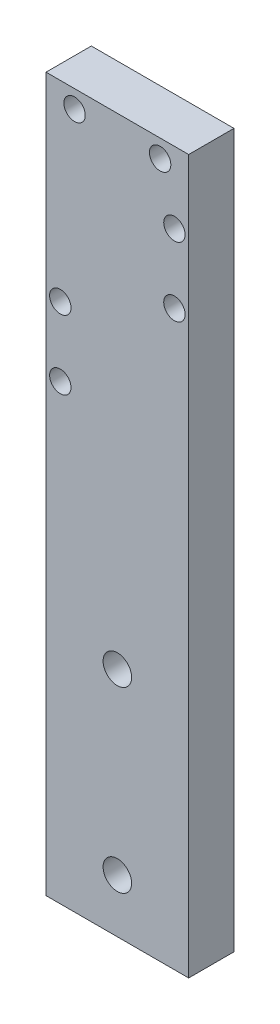
ISO-10303-21;
HEADER;
FILE_DESCRIPTION(('STEP AP214'),'2;1');
FILE_NAME('part.step','',(''),(''),'','','');
FILE_SCHEMA(('AUTOMOTIVE_DESIGN { 1 0 10303 214 1 1 1 1 }'));
ENDSEC;
DATA;
#1=APPLICATION_CONTEXT('core data for automotive mechanical design processes');
#2=APPLICATION_PROTOCOL_DEFINITION('international standard','automotive_design',2000,#1);
#3=PRODUCT_CONTEXT('',#1,'mechanical');
#4=PRODUCT('Part','Part','',(#3));
#5=PRODUCT_RELATED_PRODUCT_CATEGORY('part','',(#4));
#6=PRODUCT_DEFINITION_FORMATION('','',#4);
#7=PRODUCT_DEFINITION_CONTEXT('part definition',#1,'design');
#8=PRODUCT_DEFINITION('design','',#6,#7);
#9=PRODUCT_DEFINITION_SHAPE('','',#8);
#10=(LENGTH_UNIT() NAMED_UNIT(*) SI_UNIT(.MILLI.,.METRE.));
#11=(NAMED_UNIT(*) PLANE_ANGLE_UNIT() SI_UNIT($,.RADIAN.));
#12=(NAMED_UNIT(*) SI_UNIT($,.STERADIAN.) SOLID_ANGLE_UNIT());
#13=UNCERTAINTY_MEASURE_WITH_UNIT(LENGTH_MEASURE(1.E-05),#10,'distance_accuracy_value','');
#14=(GEOMETRIC_REPRESENTATION_CONTEXT(3) GLOBAL_UNCERTAINTY_ASSIGNED_CONTEXT((#13)) GLOBAL_UNIT_ASSIGNED_CONTEXT((#10,
#11,#12)) REPRESENTATION_CONTEXT('',''));
#15=CARTESIAN_POINT('',(0.,0.,0.));
#16=DIRECTION('',(0.,0.,1.));
#17=DIRECTION('',(1.,0.,0.));
#18=AXIS2_PLACEMENT_3D('',#15,#16,#17);
#19=CARTESIAN_POINT('',(0.,0.,6.35));
#20=DIRECTION('',(0.,0.,-1.));
#21=DIRECTION('',(-1.,0.,0.));
#22=AXIS2_PLACEMENT_3D('',#19,#20,#21);
#23=PLANE('',#22);
#24=CARTESIAN_POINT('',(4.00000000000001,97.5,6.35));
#25=DIRECTION('',(0.,0.,-1.));
#26=DIRECTION('',(-1.,0.,0.));
#27=AXIS2_PLACEMENT_3D('',#24,#25,#26);
#28=CIRCLE('',#27,1.5);
#29=CARTESIAN_POINT('',(2.50000000000001,97.5,6.35));
#30=VERTEX_POINT('',#29);
#31=EDGE_CURVE('E97',#30,#30,#28,.T.);
#32=ORIENTED_EDGE('',*,*,#31,.T.);
#33=EDGE_LOOP('',(#32));
#34=FACE_BOUND('',#33,.T.);
#35=CARTESIAN_POINT('',(18.,90.,6.35));
#36=DIRECTION('',(0.,0.,-1.));
#37=DIRECTION('',(-1.,0.,0.));
#38=AXIS2_PLACEMENT_3D('',#35,#36,#37);
#39=CIRCLE('',#38,1.5);
#40=CARTESIAN_POINT('',(16.5,90.,6.35));
#41=VERTEX_POINT('',#40);
#42=EDGE_CURVE('E100',#41,#41,#39,.T.);
#43=ORIENTED_EDGE('',*,*,#42,.T.);
#44=EDGE_LOOP('',(#43));
#45=FACE_BOUND('',#44,.T.);
#46=CARTESIAN_POINT('',(2.,63.4481639052965,6.35));
#47=DIRECTION('',(0.,0.,-1.));
#48=DIRECTION('',(-1.,0.,0.));
#49=AXIS2_PLACEMENT_3D('',#46,#47,#48);
#50=CIRCLE('',#49,1.5);
#51=CARTESIAN_POINT('',(0.499999999999999,63.4481639052965,6.35));
#52=VERTEX_POINT('',#51);
#53=EDGE_CURVE('E285',#52,#52,#50,.T.);
#54=ORIENTED_EDGE('',*,*,#53,.T.);
#55=EDGE_LOOP('',(#54));
#56=FACE_BOUND('',#55,.T.);
#57=CARTESIAN_POINT('',(2.,73.1310195921627,6.35));
#58=DIRECTION('',(0.,0.,-1.));
#59=DIRECTION('',(-1.,0.,0.));
#60=AXIS2_PLACEMENT_3D('',#57,#58,#59);
#61=CIRCLE('',#60,1.5);
#62=CARTESIAN_POINT('',(0.5,73.1310195921627,6.35));
#63=VERTEX_POINT('',#62);
#64=EDGE_CURVE('E289',#63,#63,#61,.T.);
#65=ORIENTED_EDGE('',*,*,#64,.T.);
#66=EDGE_LOOP('',(#65));
#67=FACE_BOUND('',#66,.T.);
#68=CARTESIAN_POINT('',(18.,80.3171443131339,6.35));
#69=DIRECTION('',(0.,0.,-1.));
#70=DIRECTION('',(-1.,0.,0.));
#71=AXIS2_PLACEMENT_3D('',#68,#69,#70);
#72=CIRCLE('',#71,1.5);
#73=CARTESIAN_POINT('',(16.5,80.3171443131339,6.35));
#74=VERTEX_POINT('',#73);
#75=EDGE_CURVE('E293',#74,#74,#72,.T.);
#76=ORIENTED_EDGE('',*,*,#75,.T.);
#77=EDGE_LOOP('',(#76));
#78=FACE_BOUND('',#77,.T.);
#79=CARTESIAN_POINT('',(16.,97.5,6.35));
#80=DIRECTION('',(0.,0.,-1.));
#81=DIRECTION('',(-1.,0.,0.));
#82=AXIS2_PLACEMENT_3D('',#79,#80,#81);
#83=CIRCLE('',#82,1.5);
#84=CARTESIAN_POINT('',(14.5,97.5,6.35));
#85=VERTEX_POINT('',#84);
#86=EDGE_CURVE('E296',#85,#85,#83,.T.);
#87=ORIENTED_EDGE('',*,*,#86,.T.);
#88=EDGE_LOOP('',(#87));
#89=FACE_BOUND('',#88,.T.);
#90=DIRECTION('',(0.,-1.,0.));
#91=VECTOR('',#90,1.);
#92=CARTESIAN_POINT('',(0.,0.,6.35));
#93=LINE('',#92,#91);
#94=CARTESIAN_POINT('',(0.,100.,6.35));
#95=VERTEX_POINT('',#94);
#96=CARTESIAN_POINT('',(0.,0.,6.35));
#97=VERTEX_POINT('',#96);
#98=EDGE_CURVE('E82',#95,#97,#93,.T.);
#99=ORIENTED_EDGE('',*,*,#98,.T.);
#100=DIRECTION('',(1.,0.,0.));
#101=VECTOR('',#100,1.);
#102=CARTESIAN_POINT('',(0.,0.,6.35));
#103=LINE('',#102,#101);
#104=CARTESIAN_POINT('',(20.,0.,6.35));
#105=VERTEX_POINT('',#104);
#106=EDGE_CURVE('E50',#97,#105,#103,.T.);
#107=ORIENTED_EDGE('',*,*,#106,.T.);
#108=DIRECTION('',(0.,1.,0.));
#109=VECTOR('',#108,1.);
#110=CARTESIAN_POINT('',(20.,0.,6.35));
#111=LINE('',#110,#109);
#112=CARTESIAN_POINT('',(20.,100.,6.35));
#113=VERTEX_POINT('',#112);
#114=EDGE_CURVE('E65',#105,#113,#111,.T.);
#115=ORIENTED_EDGE('',*,*,#114,.T.);
#116=DIRECTION('',(1.,0.,0.));
#117=VECTOR('',#116,1.);
#118=CARTESIAN_POINT('',(20.,100.,6.35));
#119=LINE('',#118,#117);
#120=EDGE_CURVE('E96',#95,#113,#119,.T.);
#121=ORIENTED_EDGE('',*,*,#120,.F.);
#122=EDGE_LOOP('',(#99,#107,#115,#121));
#123=FACE_BOUND('',#122,.T.);
#124=CARTESIAN_POINT('',(10.,32.5,6.35));
#125=DIRECTION('',(0.,0.,1.));
#126=DIRECTION('',(1.,0.,0.));
#127=AXIS2_PLACEMENT_3D('',#124,#125,#126);
#128=CIRCLE('',#127,2.);
#129=CARTESIAN_POINT('',(12.,32.5,6.35));
#130=VERTEX_POINT('',#129);
#131=EDGE_CURVE('E113',#130,#130,#128,.T.);
#132=ORIENTED_EDGE('',*,*,#131,.F.);
#133=EDGE_LOOP('',(#132));
#134=FACE_BOUND('',#133,.T.);
#135=CARTESIAN_POINT('',(10.,7.5,6.35));
#136=DIRECTION('',(0.,0.,1.));
#137=DIRECTION('',(1.,0.,0.));
#138=AXIS2_PLACEMENT_3D('',#135,#136,#137);
#139=CIRCLE('',#138,2.);
#140=CARTESIAN_POINT('',(12.,7.5,6.35));
#141=VERTEX_POINT('',#140);
#142=EDGE_CURVE('E107',#141,#141,#139,.T.);
#143=ORIENTED_EDGE('',*,*,#142,.F.);
#144=EDGE_LOOP('',(#143));
#145=FACE_BOUND('',#144,.T.);
#146=ADVANCED_FACE('F33',(#34,#45,#56,#67,#78,#89,#123,#134,#145),#23,.F.);
#147=CARTESIAN_POINT('',(0.,0.,0.));
#148=DIRECTION('',(0.,0.,-1.));
#149=DIRECTION('',(-1.,0.,0.));
#150=AXIS2_PLACEMENT_3D('',#147,#148,#149);
#151=PLANE('',#150);
#152=CARTESIAN_POINT('',(4.00000000000001,97.5,0.));
#153=DIRECTION('',(0.,0.,-1.));
#154=DIRECTION('',(-1.,0.,0.));
#155=AXIS2_PLACEMENT_3D('',#152,#153,#154);
#156=CIRCLE('',#155,1.5);
#157=CARTESIAN_POINT('',(2.50000000000001,97.5,0.));
#158=VERTEX_POINT('',#157);
#159=EDGE_CURVE('E276',#158,#158,#156,.T.);
#160=ORIENTED_EDGE('',*,*,#159,.F.);
#161=EDGE_LOOP('',(#160));
#162=FACE_BOUND('',#161,.T.);
#163=CARTESIAN_POINT('',(18.,90.,0.));
#164=DIRECTION('',(0.,0.,-1.));
#165=DIRECTION('',(-1.,0.,0.));
#166=AXIS2_PLACEMENT_3D('',#163,#164,#165);
#167=CIRCLE('',#166,1.5);
#168=CARTESIAN_POINT('',(16.5,90.,0.));
#169=VERTEX_POINT('',#168);
#170=EDGE_CURVE('E313',#169,#169,#167,.T.);
#171=ORIENTED_EDGE('',*,*,#170,.F.);
#172=EDGE_LOOP('',(#171));
#173=FACE_BOUND('',#172,.T.);
#174=CARTESIAN_POINT('',(2.,63.4481639052965,0.));
#175=DIRECTION('',(0.,0.,-1.));
#176=DIRECTION('',(-1.,0.,0.));
#177=AXIS2_PLACEMENT_3D('',#174,#175,#176);
#178=CIRCLE('',#177,1.5);
#179=CARTESIAN_POINT('',(0.499999999999999,63.4481639052965,0.));
#180=VERTEX_POINT('',#179);
#181=EDGE_CURVE('E309',#180,#180,#178,.T.);
#182=ORIENTED_EDGE('',*,*,#181,.F.);
#183=EDGE_LOOP('',(#182));
#184=FACE_BOUND('',#183,.T.);
#185=CARTESIAN_POINT('',(2.,73.1310195921627,0.));
#186=DIRECTION('',(0.,0.,-1.));
#187=DIRECTION('',(-1.,0.,0.));
#188=AXIS2_PLACEMENT_3D('',#185,#186,#187);
#189=CIRCLE('',#188,1.5);
#190=CARTESIAN_POINT('',(0.5,73.1310195921627,0.));
#191=VERTEX_POINT('',#190);
#192=EDGE_CURVE('E306',#191,#191,#189,.T.);
#193=ORIENTED_EDGE('',*,*,#192,.F.);
#194=EDGE_LOOP('',(#193));
#195=FACE_BOUND('',#194,.T.);
#196=CARTESIAN_POINT('',(18.,80.3171443131339,0.));
#197=DIRECTION('',(0.,0.,-1.));
#198=DIRECTION('',(-1.,0.,0.));
#199=AXIS2_PLACEMENT_3D('',#196,#197,#198);
#200=CIRCLE('',#199,1.5);
#201=CARTESIAN_POINT('',(16.5,80.3171443131339,0.));
#202=VERTEX_POINT('',#201);
#203=EDGE_CURVE('E310',#202,#202,#200,.T.);
#204=ORIENTED_EDGE('',*,*,#203,.F.);
#205=EDGE_LOOP('',(#204));
#206=FACE_BOUND('',#205,.T.);
#207=CARTESIAN_POINT('',(16.,97.5,0.));
#208=DIRECTION('',(0.,0.,-1.));
#209=DIRECTION('',(-1.,0.,0.));
#210=AXIS2_PLACEMENT_3D('',#207,#208,#209);
#211=CIRCLE('',#210,1.5);
#212=CARTESIAN_POINT('',(14.5,97.5,0.));
#213=VERTEX_POINT('',#212);
#214=EDGE_CURVE('E298',#213,#213,#211,.T.);
#215=ORIENTED_EDGE('',*,*,#214,.F.);
#216=EDGE_LOOP('',(#215));
#217=FACE_BOUND('',#216,.T.);
#218=CARTESIAN_POINT('',(10.,32.5,0.));
#219=DIRECTION('',(0.,0.,1.));
#220=DIRECTION('',(1.,0.,0.));
#221=AXIS2_PLACEMENT_3D('',#218,#219,#220);
#222=CIRCLE('',#221,2.);
#223=CARTESIAN_POINT('',(12.,32.5,0.));
#224=VERTEX_POINT('',#223);
#225=EDGE_CURVE('E110',#224,#224,#222,.T.);
#226=ORIENTED_EDGE('',*,*,#225,.T.);
#227=EDGE_LOOP('',(#226));
#228=FACE_BOUND('',#227,.T.);
#229=DIRECTION('',(0.,-1.,0.));
#230=VECTOR('',#229,1.);
#231=CARTESIAN_POINT('',(0.,0.,0.));
#232=LINE('',#231,#230);
#233=CARTESIAN_POINT('',(0.,100.,0.));
#234=VERTEX_POINT('',#233);
#235=CARTESIAN_POINT('',(0.,0.,0.));
#236=VERTEX_POINT('',#235);
#237=EDGE_CURVE('E89',#234,#236,#232,.T.);
#238=ORIENTED_EDGE('',*,*,#237,.F.);
#239=DIRECTION('',(-1.,0.,0.));
#240=VECTOR('',#239,1.);
#241=CARTESIAN_POINT('',(20.,100.,0.));
#242=LINE('',#241,#240);
#243=CARTESIAN_POINT('',(20.,100.,0.));
#244=VERTEX_POINT('',#243);
#245=EDGE_CURVE('E85',#244,#234,#242,.T.);
#246=ORIENTED_EDGE('',*,*,#245,.F.);
#247=DIRECTION('',(0.,1.,0.));
#248=VECTOR('',#247,1.);
#249=CARTESIAN_POINT('',(20.,0.,0.));
#250=LINE('',#249,#248);
#251=CARTESIAN_POINT('',(20.,0.,0.));
#252=VERTEX_POINT('',#251);
#253=EDGE_CURVE('E77',#252,#244,#250,.T.);
#254=ORIENTED_EDGE('',*,*,#253,.F.);
#255=DIRECTION('',(1.,0.,0.));
#256=VECTOR('',#255,1.);
#257=CARTESIAN_POINT('',(0.,0.,0.));
#258=LINE('',#257,#256);
#259=EDGE_CURVE('E61',#236,#252,#258,.T.);
#260=ORIENTED_EDGE('',*,*,#259,.F.);
#261=EDGE_LOOP('',(#238,#246,#254,#260));
#262=FACE_BOUND('',#261,.T.);
#263=CARTESIAN_POINT('',(10.,7.5,0.));
#264=DIRECTION('',(0.,0.,1.));
#265=DIRECTION('',(1.,0.,0.));
#266=AXIS2_PLACEMENT_3D('',#263,#264,#265);
#267=CIRCLE('',#266,2.);
#268=CARTESIAN_POINT('',(12.,7.5,0.));
#269=VERTEX_POINT('',#268);
#270=EDGE_CURVE('E106',#269,#269,#267,.T.);
#271=ORIENTED_EDGE('',*,*,#270,.T.);
#272=EDGE_LOOP('',(#271));
#273=FACE_BOUND('',#272,.T.);
#274=ADVANCED_FACE('F86',(#162,#173,#184,#195,#206,#217,#228,#262,#273),#151,.T.);
#275=CARTESIAN_POINT('',(0.,0.,6.35));
#276=DIRECTION('',(1.,0.,0.));
#277=DIRECTION('',(0.,0.,-1.));
#278=AXIS2_PLACEMENT_3D('',#275,#276,#277);
#279=PLANE('',#278);
#280=ORIENTED_EDGE('',*,*,#237,.T.);
#281=DIRECTION('',(0.,0.,-1.));
#282=VECTOR('',#281,1.);
#283=CARTESIAN_POINT('',(0.,0.,6.35));
#284=LINE('',#283,#282);
#285=EDGE_CURVE('E11',#97,#236,#284,.T.);
#286=ORIENTED_EDGE('',*,*,#285,.F.);
#287=ORIENTED_EDGE('',*,*,#98,.F.);
#288=DIRECTION('',(0.,0.,1.));
#289=VECTOR('',#288,1.);
#290=CARTESIAN_POINT('',(0.,100.,6.35));
#291=LINE('',#290,#289);
#292=EDGE_CURVE('E93',#234,#95,#291,.T.);
#293=ORIENTED_EDGE('',*,*,#292,.F.);
#294=EDGE_LOOP('',(#280,#286,#287,#293));
#295=FACE_BOUND('',#294,.T.);
#296=ADVANCED_FACE('F35',(#295),#279,.F.);
#297=CARTESIAN_POINT('',(0.,0.,6.35));
#298=DIRECTION('',(0.,1.,0.));
#299=DIRECTION('',(0.,0.,1.));
#300=AXIS2_PLACEMENT_3D('',#297,#298,#299);
#301=PLANE('',#300);
#302=ORIENTED_EDGE('',*,*,#259,.T.);
#303=DIRECTION('',(0.,0.,-1.));
#304=VECTOR('',#303,1.);
#305=CARTESIAN_POINT('',(20.,0.,6.35));
#306=LINE('',#305,#304);
#307=EDGE_CURVE('E42',#105,#252,#306,.T.);
#308=ORIENTED_EDGE('',*,*,#307,.F.);
#309=ORIENTED_EDGE('',*,*,#106,.F.);
#310=ORIENTED_EDGE('',*,*,#285,.T.);
#311=EDGE_LOOP('',(#302,#308,#309,#310));
#312=FACE_BOUND('',#311,.T.);
#313=ADVANCED_FACE('F123',(#312),#301,.F.);
#314=CARTESIAN_POINT('',(20.,0.,6.35));
#315=DIRECTION('',(-1.,0.,0.));
#316=DIRECTION('',(0.,0.,1.));
#317=AXIS2_PLACEMENT_3D('',#314,#315,#316);
#318=PLANE('',#317);
#319=ORIENTED_EDGE('',*,*,#253,.T.);
#320=DIRECTION('',(0.,0.,-1.));
#321=VECTOR('',#320,1.);
#322=CARTESIAN_POINT('',(20.,100.,6.35));
#323=LINE('',#322,#321);
#324=EDGE_CURVE('E81',#113,#244,#323,.T.);
#325=ORIENTED_EDGE('',*,*,#324,.F.);
#326=ORIENTED_EDGE('',*,*,#114,.F.);
#327=ORIENTED_EDGE('',*,*,#307,.T.);
#328=EDGE_LOOP('',(#319,#325,#326,#327));
#329=FACE_BOUND('',#328,.T.);
#330=ADVANCED_FACE('F79',(#329),#318,.F.);
#331=CARTESIAN_POINT('',(10.,32.5,6.35));
#332=DIRECTION('',(0.,0.,-1.));
#333=DIRECTION('',(-1.,0.,0.));
#334=AXIS2_PLACEMENT_3D('',#331,#332,#333);
#335=CYLINDRICAL_SURFACE('',#334,2.);
#336=ORIENTED_EDGE('',*,*,#131,.T.);
#337=EDGE_LOOP('',(#336));
#338=FACE_BOUND('',#337,.T.);
#339=ORIENTED_EDGE('',*,*,#225,.F.);
#340=EDGE_LOOP('',(#339));
#341=FACE_BOUND('',#340,.T.);
#342=ADVANCED_FACE('F137',(#338,#341),#335,.F.);
#343=CARTESIAN_POINT('',(10.,7.5,6.35));
#344=DIRECTION('',(0.,0.,-1.));
#345=DIRECTION('',(-1.,0.,0.));
#346=AXIS2_PLACEMENT_3D('',#343,#344,#345);
#347=CYLINDRICAL_SURFACE('',#346,2.);
#348=ORIENTED_EDGE('',*,*,#142,.T.);
#349=EDGE_LOOP('',(#348));
#350=FACE_BOUND('',#349,.T.);
#351=ORIENTED_EDGE('',*,*,#270,.F.);
#352=EDGE_LOOP('',(#351));
#353=FACE_BOUND('',#352,.T.);
#354=ADVANCED_FACE('F134',(#350,#353),#347,.F.);
#355=CARTESIAN_POINT('',(0.,100.,0.));
#356=DIRECTION('',(0.,1.,0.));
#357=DIRECTION('',(0.,0.,1.));
#358=AXIS2_PLACEMENT_3D('',#355,#356,#357);
#359=PLANE('',#358);
#360=ORIENTED_EDGE('',*,*,#324,.T.);
#361=ORIENTED_EDGE('',*,*,#245,.T.);
#362=ORIENTED_EDGE('',*,*,#292,.T.);
#363=ORIENTED_EDGE('',*,*,#120,.T.);
#364=EDGE_LOOP('',(#360,#361,#362,#363));
#365=FACE_BOUND('',#364,.T.);
#366=ADVANCED_FACE('F95',(#365),#359,.T.);
#367=CARTESIAN_POINT('',(16.,97.5,23.2));
#368=DIRECTION('',(0.,0.,-1.));
#369=DIRECTION('',(-1.,0.,0.));
#370=AXIS2_PLACEMENT_3D('',#367,#368,#369);
#371=CYLINDRICAL_SURFACE('',#370,1.5);
#372=ORIENTED_EDGE('',*,*,#214,.T.);
#373=EDGE_LOOP('',(#372));
#374=FACE_BOUND('',#373,.T.);
#375=ORIENTED_EDGE('',*,*,#86,.F.);
#376=EDGE_LOOP('',(#375));
#377=FACE_BOUND('',#376,.T.);
#378=ADVANCED_FACE('F176',(#374,#377),#371,.F.);
#379=CARTESIAN_POINT('',(18.,80.3171443131339,23.2));
#380=DIRECTION('',(0.,0.,-1.));
#381=DIRECTION('',(-1.,0.,0.));
#382=AXIS2_PLACEMENT_3D('',#379,#380,#381);
#383=CYLINDRICAL_SURFACE('',#382,1.5);
#384=ORIENTED_EDGE('',*,*,#203,.T.);
#385=EDGE_LOOP('',(#384));
#386=FACE_BOUND('',#385,.T.);
#387=ORIENTED_EDGE('',*,*,#75,.F.);
#388=EDGE_LOOP('',(#387));
#389=FACE_BOUND('',#388,.T.);
#390=ADVANCED_FACE('F184',(#386,#389),#383,.F.);
#391=CARTESIAN_POINT('',(2.,73.1310195921627,23.2));
#392=DIRECTION('',(0.,0.,-1.));
#393=DIRECTION('',(-1.,0.,0.));
#394=AXIS2_PLACEMENT_3D('',#391,#392,#393);
#395=CYLINDRICAL_SURFACE('',#394,1.5);
#396=ORIENTED_EDGE('',*,*,#192,.T.);
#397=EDGE_LOOP('',(#396));
#398=FACE_BOUND('',#397,.T.);
#399=ORIENTED_EDGE('',*,*,#64,.F.);
#400=EDGE_LOOP('',(#399));
#401=FACE_BOUND('',#400,.T.);
#402=ADVANCED_FACE('F192',(#398,#401),#395,.F.);
#403=CARTESIAN_POINT('',(2.,63.4481639052965,23.2));
#404=DIRECTION('',(0.,0.,-1.));
#405=DIRECTION('',(-1.,0.,0.));
#406=AXIS2_PLACEMENT_3D('',#403,#404,#405);
#407=CYLINDRICAL_SURFACE('',#406,1.5);
#408=ORIENTED_EDGE('',*,*,#181,.T.);
#409=EDGE_LOOP('',(#408));
#410=FACE_BOUND('',#409,.T.);
#411=ORIENTED_EDGE('',*,*,#53,.F.);
#412=EDGE_LOOP('',(#411));
#413=FACE_BOUND('',#412,.T.);
#414=ADVANCED_FACE('F200',(#410,#413),#407,.F.);
#415=CARTESIAN_POINT('',(18.,90.,23.2));
#416=DIRECTION('',(0.,0.,-1.));
#417=DIRECTION('',(-1.,0.,0.));
#418=AXIS2_PLACEMENT_3D('',#415,#416,#417);
#419=CYLINDRICAL_SURFACE('',#418,1.5);
#420=ORIENTED_EDGE('',*,*,#170,.T.);
#421=EDGE_LOOP('',(#420));
#422=FACE_BOUND('',#421,.T.);
#423=ORIENTED_EDGE('',*,*,#42,.F.);
#424=EDGE_LOOP('',(#423));
#425=FACE_BOUND('',#424,.T.);
#426=ADVANCED_FACE('F208',(#422,#425),#419,.F.);
#427=CARTESIAN_POINT('',(4.00000000000001,97.5,23.2));
#428=DIRECTION('',(0.,0.,-1.));
#429=DIRECTION('',(-1.,0.,0.));
#430=AXIS2_PLACEMENT_3D('',#427,#428,#429);
#431=CYLINDRICAL_SURFACE('',#430,1.5);
#432=ORIENTED_EDGE('',*,*,#159,.T.);
#433=EDGE_LOOP('',(#432));
#434=FACE_BOUND('',#433,.T.);
#435=ORIENTED_EDGE('',*,*,#31,.F.);
#436=EDGE_LOOP('',(#435));
#437=FACE_BOUND('',#436,.T.);
#438=ADVANCED_FACE('F216',(#434,#437),#431,.F.);
#439=CLOSED_SHELL('',(#146,#274,#296,#313,#330,#342,#354,#366,#378,#390,#402,#414,#426,#438));
#440=MANIFOLD_SOLID_BREP('B2',#439);
#441=ADVANCED_BREP_SHAPE_REPRESENTATION('',(#18,#440),#14);
#442=SHAPE_DEFINITION_REPRESENTATION(#9,#441);
ENDSEC;
END-ISO-10303-21;
